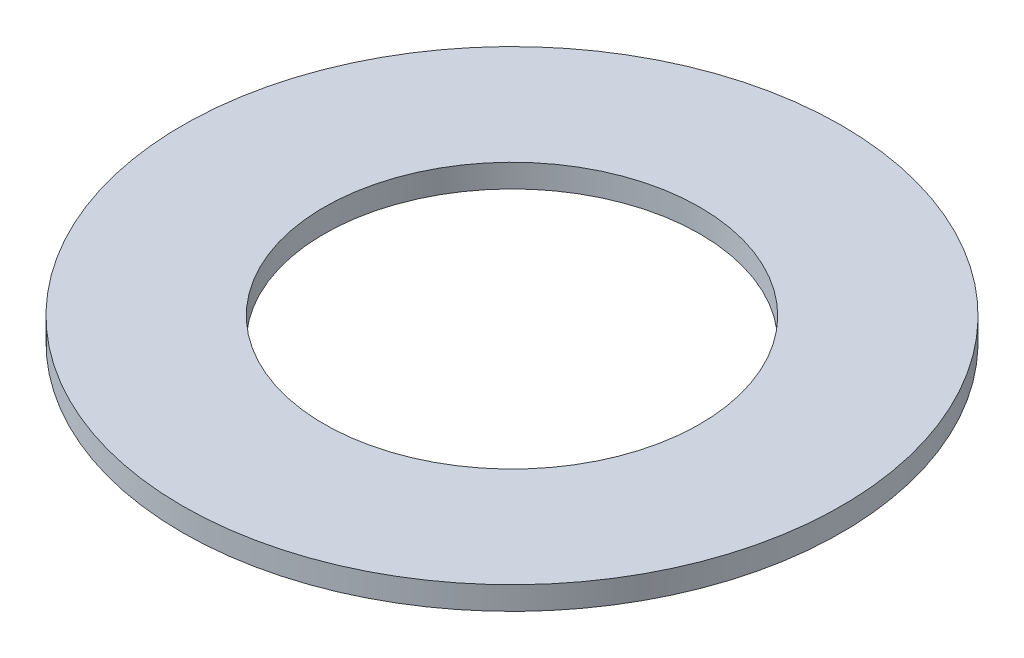
ISO-10303-21;
HEADER;
FILE_DESCRIPTION(('STEP AP214'),'2;1');
FILE_NAME('part.step','',(''),(''),'','','');
FILE_SCHEMA(('AUTOMOTIVE_DESIGN { 1 0 10303 214 1 1 1 1 }'));
ENDSEC;
DATA;
#1=APPLICATION_CONTEXT('core data for automotive mechanical design processes');
#2=APPLICATION_PROTOCOL_DEFINITION('international standard','automotive_design',2000,#1);
#3=PRODUCT_CONTEXT('',#1,'mechanical');
#4=PRODUCT('Part','Part','',(#3));
#5=PRODUCT_RELATED_PRODUCT_CATEGORY('part','',(#4));
#6=PRODUCT_DEFINITION_FORMATION('','',#4);
#7=PRODUCT_DEFINITION_CONTEXT('part definition',#1,'design');
#8=PRODUCT_DEFINITION('design','',#6,#7);
#9=PRODUCT_DEFINITION_SHAPE('','',#8);
#10=(LENGTH_UNIT() NAMED_UNIT(*) SI_UNIT(.MILLI.,.METRE.));
#11=(NAMED_UNIT(*) PLANE_ANGLE_UNIT() SI_UNIT($,.RADIAN.));
#12=(NAMED_UNIT(*) SI_UNIT($,.STERADIAN.) SOLID_ANGLE_UNIT());
#13=UNCERTAINTY_MEASURE_WITH_UNIT(LENGTH_MEASURE(1.E-05),#10,'distance_accuracy_value','');
#14=(GEOMETRIC_REPRESENTATION_CONTEXT(3) GLOBAL_UNCERTAINTY_ASSIGNED_CONTEXT((#13)) GLOBAL_UNIT_ASSIGNED_CONTEXT((#10,
#11,#12)) REPRESENTATION_CONTEXT('',''));
#15=CARTESIAN_POINT('',(0.,0.,0.));
#16=DIRECTION('',(0.,0.,1.));
#17=DIRECTION('',(1.,0.,0.));
#18=AXIS2_PLACEMENT_3D('',#15,#16,#17);
#19=CARTESIAN_POINT('',(0.,0.,0.));
#20=DIRECTION('',(0.,-1.,0.));
#21=DIRECTION('',(0.,0.,-1.));
#22=AXIS2_PLACEMENT_3D('',#19,#20,#21);
#23=CYLINDRICAL_SURFACE('',#22,32.5);
#24=CARTESIAN_POINT('',(0.,-2.,0.));
#25=DIRECTION('',(0.,-1.,0.));
#26=DIRECTION('',(0.,0.,-1.));
#27=AXIS2_PLACEMENT_3D('',#24,#25,#26);
#28=CIRCLE('',#27,32.5);
#29=CARTESIAN_POINT('',(0.,-2.,-32.5));
#30=VERTEX_POINT('',#29);
#31=EDGE_CURVE('E10',#30,#30,#28,.T.);
#32=ORIENTED_EDGE('',*,*,#31,.T.);
#33=EDGE_LOOP('',(#32));
#34=FACE_BOUND('',#33,.T.);
#35=CARTESIAN_POINT('',(0.,2.,0.));
#36=DIRECTION('',(0.,-1.,0.));
#37=DIRECTION('',(0.,0.,-1.));
#38=AXIS2_PLACEMENT_3D('',#35,#36,#37);
#39=CIRCLE('',#38,32.5);
#40=CARTESIAN_POINT('',(0.,2.,-32.5));
#41=VERTEX_POINT('',#40);
#42=EDGE_CURVE('E60',#41,#41,#39,.T.);
#43=ORIENTED_EDGE('',*,*,#42,.F.);
#44=EDGE_LOOP('',(#43));
#45=FACE_BOUND('',#44,.T.);
#46=ADVANCED_FACE('F41',(#34,#45),#23,.F.);
#47=CARTESIAN_POINT('',(32.5,-2.,0.));
#48=DIRECTION('',(0.,-1.,0.));
#49=DIRECTION('',(0.,0.,-1.));
#50=AXIS2_PLACEMENT_3D('',#47,#48,#49);
#51=PLANE('',#50);
#52=CARTESIAN_POINT('',(0.,-2.,0.));
#53=DIRECTION('',(0.,-1.,0.));
#54=DIRECTION('',(0.,0.,-1.));
#55=AXIS2_PLACEMENT_3D('',#52,#53,#54);
#56=CIRCLE('',#55,57.);
#57=CARTESIAN_POINT('',(0.,-2.,-57.));
#58=VERTEX_POINT('',#57);
#59=EDGE_CURVE('E48',#58,#58,#56,.T.);
#60=ORIENTED_EDGE('',*,*,#59,.T.);
#61=EDGE_LOOP('',(#60));
#62=FACE_BOUND('',#61,.T.);
#63=ORIENTED_EDGE('',*,*,#31,.F.);
#64=EDGE_LOOP('',(#63));
#65=FACE_BOUND('',#64,.T.);
#66=ADVANCED_FACE('F72',(#62,#65),#51,.T.);
#67=CARTESIAN_POINT('',(0.,0.,0.));
#68=DIRECTION('',(0.,-1.,0.));
#69=DIRECTION('',(0.,0.,-1.));
#70=AXIS2_PLACEMENT_3D('',#67,#68,#69);
#71=CYLINDRICAL_SURFACE('',#70,57.);
#72=CARTESIAN_POINT('',(0.,2.,0.));
#73=DIRECTION('',(0.,-1.,0.));
#74=DIRECTION('',(0.,0.,-1.));
#75=AXIS2_PLACEMENT_3D('',#72,#73,#74);
#76=CIRCLE('',#75,57.);
#77=CARTESIAN_POINT('',(0.,2.,-57.));
#78=VERTEX_POINT('',#77);
#79=EDGE_CURVE('E54',#78,#78,#76,.T.);
#80=ORIENTED_EDGE('',*,*,#79,.T.);
#81=EDGE_LOOP('',(#80));
#82=FACE_BOUND('',#81,.T.);
#83=ORIENTED_EDGE('',*,*,#59,.F.);
#84=EDGE_LOOP('',(#83));
#85=FACE_BOUND('',#84,.T.);
#86=ADVANCED_FACE('F76',(#82,#85),#71,.T.);
#87=CARTESIAN_POINT('',(32.5,2.,0.));
#88=DIRECTION('',(0.,1.,0.));
#89=DIRECTION('',(0.,0.,1.));
#90=AXIS2_PLACEMENT_3D('',#87,#88,#89);
#91=PLANE('',#90);
#92=ORIENTED_EDGE('',*,*,#42,.T.);
#93=EDGE_LOOP('',(#92));
#94=FACE_BOUND('',#93,.T.);
#95=ORIENTED_EDGE('',*,*,#79,.F.);
#96=EDGE_LOOP('',(#95));
#97=FACE_BOUND('',#96,.T.);
#98=ADVANCED_FACE('F68',(#94,#97),#91,.T.);
#99=CLOSED_SHELL('',(#46,#66,#86,#98));
#100=MANIFOLD_SOLID_BREP('B2',#99);
#101=ADVANCED_BREP_SHAPE_REPRESENTATION('',(#18,#100),#14);
#102=SHAPE_DEFINITION_REPRESENTATION(#9,#101);
ENDSEC;
END-ISO-10303-21;
